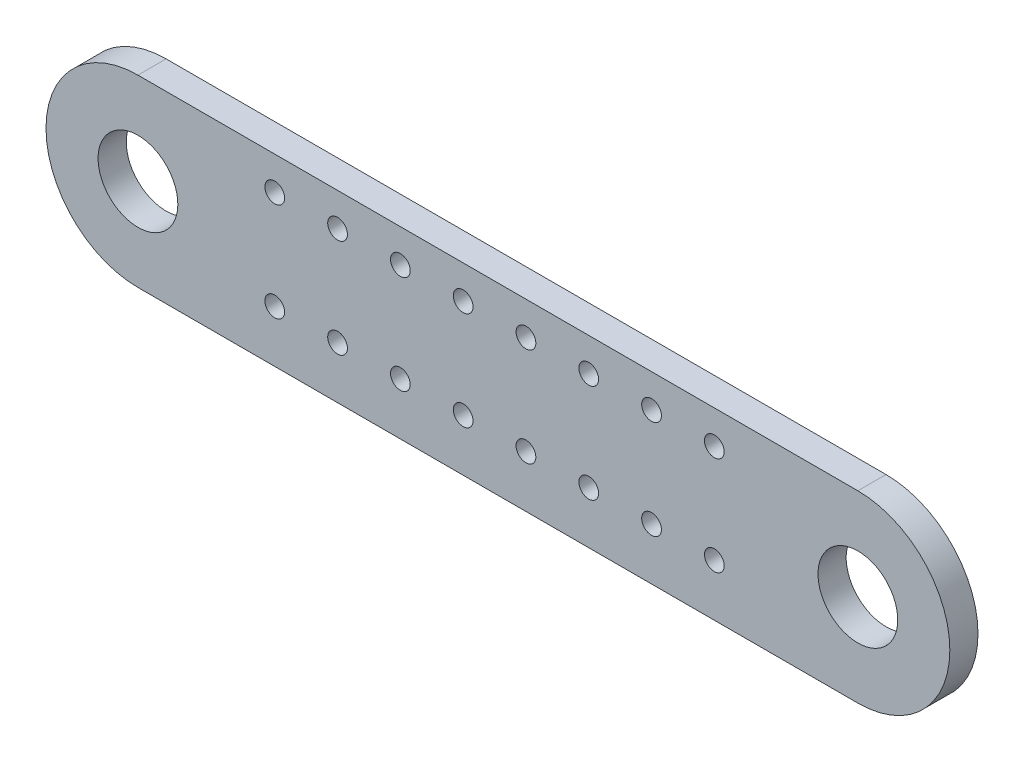
ISO-10303-21;
HEADER;
FILE_DESCRIPTION(('STEP AP214'),'2;1');
FILE_NAME('part.step','',(''),(''),'','','');
FILE_SCHEMA(('AUTOMOTIVE_DESIGN { 1 0 10303 214 1 1 1 1 }'));
ENDSEC;
DATA;
#1=APPLICATION_CONTEXT('core data for automotive mechanical design processes');
#2=APPLICATION_PROTOCOL_DEFINITION('international standard','automotive_design',2000,#1);
#3=PRODUCT_CONTEXT('',#1,'mechanical');
#4=PRODUCT('Part','Part','',(#3));
#5=PRODUCT_RELATED_PRODUCT_CATEGORY('part','',(#4));
#6=PRODUCT_DEFINITION_FORMATION('','',#4);
#7=PRODUCT_DEFINITION_CONTEXT('part definition',#1,'design');
#8=PRODUCT_DEFINITION('design','',#6,#7);
#9=PRODUCT_DEFINITION_SHAPE('','',#8);
#10=(LENGTH_UNIT() NAMED_UNIT(*) SI_UNIT(.MILLI.,.METRE.));
#11=(NAMED_UNIT(*) PLANE_ANGLE_UNIT() SI_UNIT($,.RADIAN.));
#12=(NAMED_UNIT(*) SI_UNIT($,.STERADIAN.) SOLID_ANGLE_UNIT());
#13=UNCERTAINTY_MEASURE_WITH_UNIT(LENGTH_MEASURE(1.E-05),#10,'distance_accuracy_value','');
#14=(GEOMETRIC_REPRESENTATION_CONTEXT(3) GLOBAL_UNCERTAINTY_ASSIGNED_CONTEXT((#13)) GLOBAL_UNIT_ASSIGNED_CONTEXT((#10,
#11,#12)) REPRESENTATION_CONTEXT('',''));
#15=CARTESIAN_POINT('',(0.,0.,0.));
#16=DIRECTION('',(0.,0.,1.));
#17=DIRECTION('',(1.,0.,0.));
#18=AXIS2_PLACEMENT_3D('',#15,#16,#17);
#19=CARTESIAN_POINT('',(25.1875,5.125,1.57));
#20=DIRECTION('',(0.,0.,1.));
#21=DIRECTION('',(1.,0.,0.));
#22=AXIS2_PLACEMENT_3D('',#19,#20,#21);
#23=PLANE('',#22);
#24=CARTESIAN_POINT('',(45.25,5.125,1.57));
#25=DIRECTION('',(0.,0.,1.));
#26=DIRECTION('',(1.,0.,0.));
#27=AXIS2_PLACEMENT_3D('',#24,#25,#26);
#28=CIRCLE('',#27,2.2225);
#29=CARTESIAN_POINT('',(47.4725,5.125,1.57));
#30=VERTEX_POINT('',#29);
#31=EDGE_CURVE('E137',#30,#30,#28,.F.);
#32=ORIENTED_EDGE('',*,*,#31,.T.);
#33=EDGE_LOOP('',(#32));
#34=FACE_BOUND('',#33,.T.);
#35=CARTESIAN_POINT('',(5.125,5.125,1.57));
#36=DIRECTION('',(0.,0.,1.));
#37=DIRECTION('',(1.,0.,0.));
#38=AXIS2_PLACEMENT_3D('',#35,#36,#37);
#39=CIRCLE('',#38,2.2225);
#40=CARTESIAN_POINT('',(7.3475,5.125,1.57));
#41=VERTEX_POINT('',#40);
#42=EDGE_CURVE('E140',#41,#41,#39,.F.);
#43=ORIENTED_EDGE('',*,*,#42,.T.);
#44=EDGE_LOOP('',(#43));
#45=FACE_BOUND('',#44,.T.);
#46=CARTESIAN_POINT('',(12.75,8.4,1.57));
#47=DIRECTION('',(0.,0.,1.));
#48=DIRECTION('',(1.,0.,0.));
#49=AXIS2_PLACEMENT_3D('',#46,#47,#48);
#50=CIRCLE('',#49,0.549999999999999);
#51=CARTESIAN_POINT('',(13.3,8.4,1.57));
#52=VERTEX_POINT('',#51);
#53=EDGE_CURVE('E143',#52,#52,#50,.F.);
#54=ORIENTED_EDGE('',*,*,#53,.T.);
#55=EDGE_LOOP('',(#54));
#56=FACE_BOUND('',#55,.T.);
#57=CARTESIAN_POINT('',(37.25,8.4,1.57));
#58=DIRECTION('',(0.,0.,1.));
#59=DIRECTION('',(1.,0.,0.));
#60=AXIS2_PLACEMENT_3D('',#57,#58,#59);
#61=CIRCLE('',#60,0.550000000000002);
#62=CARTESIAN_POINT('',(37.8,8.4,1.57));
#63=VERTEX_POINT('',#62);
#64=EDGE_CURVE('E146',#63,#63,#61,.F.);
#65=ORIENTED_EDGE('',*,*,#64,.T.);
#66=EDGE_LOOP('',(#65));
#67=FACE_BOUND('',#66,.T.);
#68=CARTESIAN_POINT('',(16.25,8.4,1.57));
#69=DIRECTION('',(0.,0.,1.));
#70=DIRECTION('',(1.,0.,0.));
#71=AXIS2_PLACEMENT_3D('',#68,#69,#70);
#72=CIRCLE('',#71,0.549999999999999);
#73=CARTESIAN_POINT('',(16.8,8.4,1.57));
#74=VERTEX_POINT('',#73);
#75=EDGE_CURVE('E149',#74,#74,#72,.F.);
#76=ORIENTED_EDGE('',*,*,#75,.T.);
#77=EDGE_LOOP('',(#76));
#78=FACE_BOUND('',#77,.T.);
#79=CARTESIAN_POINT('',(23.25,8.4,1.57));
#80=DIRECTION('',(0.,0.,1.));
#81=DIRECTION('',(1.,0.,0.));
#82=AXIS2_PLACEMENT_3D('',#79,#80,#81);
#83=CIRCLE('',#82,0.550000000000002);
#84=CARTESIAN_POINT('',(23.8,8.4,1.57));
#85=VERTEX_POINT('',#84);
#86=EDGE_CURVE('E152',#85,#85,#83,.F.);
#87=ORIENTED_EDGE('',*,*,#86,.T.);
#88=EDGE_LOOP('',(#87));
#89=FACE_BOUND('',#88,.T.);
#90=CARTESIAN_POINT('',(16.25,2.9,1.57));
#91=DIRECTION('',(0.,0.,1.));
#92=DIRECTION('',(1.,0.,0.));
#93=AXIS2_PLACEMENT_3D('',#90,#91,#92);
#94=CIRCLE('',#93,0.549999999999999);
#95=CARTESIAN_POINT('',(16.8,2.9,1.57));
#96=VERTEX_POINT('',#95);
#97=EDGE_CURVE('E155',#96,#96,#94,.F.);
#98=ORIENTED_EDGE('',*,*,#97,.T.);
#99=EDGE_LOOP('',(#98));
#100=FACE_BOUND('',#99,.T.);
#101=CARTESIAN_POINT('',(33.75,8.4,1.57));
#102=DIRECTION('',(0.,0.,1.));
#103=DIRECTION('',(1.,0.,0.));
#104=AXIS2_PLACEMENT_3D('',#101,#102,#103);
#105=CIRCLE('',#104,0.550000000000002);
#106=CARTESIAN_POINT('',(34.3,8.4,1.57));
#107=VERTEX_POINT('',#106);
#108=EDGE_CURVE('E158',#107,#107,#105,.F.);
#109=ORIENTED_EDGE('',*,*,#108,.T.);
#110=EDGE_LOOP('',(#109));
#111=FACE_BOUND('',#110,.T.);
#112=CARTESIAN_POINT('',(30.25,2.9,1.57));
#113=DIRECTION('',(0.,0.,1.));
#114=DIRECTION('',(1.,0.,0.));
#115=AXIS2_PLACEMENT_3D('',#112,#113,#114);
#116=CIRCLE('',#115,0.550000000000002);
#117=CARTESIAN_POINT('',(30.8,2.9,1.57));
#118=VERTEX_POINT('',#117);
#119=EDGE_CURVE('E161',#118,#118,#116,.F.);
#120=ORIENTED_EDGE('',*,*,#119,.T.);
#121=EDGE_LOOP('',(#120));
#122=FACE_BOUND('',#121,.T.);
#123=CARTESIAN_POINT('',(23.25,2.9,1.57));
#124=DIRECTION('',(0.,0.,1.));
#125=DIRECTION('',(1.,0.,0.));
#126=AXIS2_PLACEMENT_3D('',#123,#124,#125);
#127=CIRCLE('',#126,0.550000000000002);
#128=CARTESIAN_POINT('',(23.8,2.9,1.57));
#129=VERTEX_POINT('',#128);
#130=EDGE_CURVE('E164',#129,#129,#127,.F.);
#131=ORIENTED_EDGE('',*,*,#130,.T.);
#132=EDGE_LOOP('',(#131));
#133=FACE_BOUND('',#132,.T.);
#134=CARTESIAN_POINT('',(19.75,2.9,1.57));
#135=DIRECTION('',(0.,0.,1.));
#136=DIRECTION('',(1.,0.,0.));
#137=AXIS2_PLACEMENT_3D('',#134,#135,#136);
#138=CIRCLE('',#137,0.550000000000002);
#139=CARTESIAN_POINT('',(20.3,2.9,1.57));
#140=VERTEX_POINT('',#139);
#141=EDGE_CURVE('E167',#140,#140,#138,.F.);
#142=ORIENTED_EDGE('',*,*,#141,.T.);
#143=EDGE_LOOP('',(#142));
#144=FACE_BOUND('',#143,.T.);
#145=CARTESIAN_POINT('',(26.75,2.9,1.57));
#146=DIRECTION('',(0.,0.,1.));
#147=DIRECTION('',(1.,0.,0.));
#148=AXIS2_PLACEMENT_3D('',#145,#146,#147);
#149=CIRCLE('',#148,0.550000000000002);
#150=CARTESIAN_POINT('',(27.3,2.9,1.57));
#151=VERTEX_POINT('',#150);
#152=EDGE_CURVE('E170',#151,#151,#149,.F.);
#153=ORIENTED_EDGE('',*,*,#152,.T.);
#154=EDGE_LOOP('',(#153));
#155=FACE_BOUND('',#154,.T.);
#156=CARTESIAN_POINT('',(33.75,2.9,1.57));
#157=DIRECTION('',(0.,0.,1.));
#158=DIRECTION('',(1.,0.,0.));
#159=AXIS2_PLACEMENT_3D('',#156,#157,#158);
#160=CIRCLE('',#159,0.550000000000002);
#161=CARTESIAN_POINT('',(34.3,2.9,1.57));
#162=VERTEX_POINT('',#161);
#163=EDGE_CURVE('E173',#162,#162,#160,.F.);
#164=ORIENTED_EDGE('',*,*,#163,.T.);
#165=EDGE_LOOP('',(#164));
#166=FACE_BOUND('',#165,.T.);
#167=CARTESIAN_POINT('',(30.25,8.4,1.57));
#168=DIRECTION('',(0.,0.,1.));
#169=DIRECTION('',(1.,0.,0.));
#170=AXIS2_PLACEMENT_3D('',#167,#168,#169);
#171=CIRCLE('',#170,0.550000000000002);
#172=CARTESIAN_POINT('',(30.8,8.4,1.57));
#173=VERTEX_POINT('',#172);
#174=EDGE_CURVE('E176',#173,#173,#171,.F.);
#175=ORIENTED_EDGE('',*,*,#174,.T.);
#176=EDGE_LOOP('',(#175));
#177=FACE_BOUND('',#176,.T.);
#178=CARTESIAN_POINT('',(26.75,8.4,1.57));
#179=DIRECTION('',(0.,0.,1.));
#180=DIRECTION('',(1.,0.,0.));
#181=AXIS2_PLACEMENT_3D('',#178,#179,#180);
#182=CIRCLE('',#181,0.550000000000002);
#183=CARTESIAN_POINT('',(27.3,8.4,1.57));
#184=VERTEX_POINT('',#183);
#185=EDGE_CURVE('E179',#184,#184,#182,.F.);
#186=ORIENTED_EDGE('',*,*,#185,.T.);
#187=EDGE_LOOP('',(#186));
#188=FACE_BOUND('',#187,.T.);
#189=CARTESIAN_POINT('',(19.75,8.4,1.57));
#190=DIRECTION('',(0.,0.,1.));
#191=DIRECTION('',(1.,0.,0.));
#192=AXIS2_PLACEMENT_3D('',#189,#190,#191);
#193=CIRCLE('',#192,0.550000000000002);
#194=CARTESIAN_POINT('',(20.3,8.4,1.57));
#195=VERTEX_POINT('',#194);
#196=EDGE_CURVE('E182',#195,#195,#193,.F.);
#197=ORIENTED_EDGE('',*,*,#196,.T.);
#198=EDGE_LOOP('',(#197));
#199=FACE_BOUND('',#198,.T.);
#200=CARTESIAN_POINT('',(37.25,2.9,1.57));
#201=DIRECTION('',(0.,0.,1.));
#202=DIRECTION('',(1.,0.,0.));
#203=AXIS2_PLACEMENT_3D('',#200,#201,#202);
#204=CIRCLE('',#203,0.550000000000002);
#205=CARTESIAN_POINT('',(37.8,2.9,1.57));
#206=VERTEX_POINT('',#205);
#207=EDGE_CURVE('E185',#206,#206,#204,.F.);
#208=ORIENTED_EDGE('',*,*,#207,.T.);
#209=EDGE_LOOP('',(#208));
#210=FACE_BOUND('',#209,.T.);
#211=CARTESIAN_POINT('',(12.75,2.9,1.57));
#212=DIRECTION('',(0.,0.,1.));
#213=DIRECTION('',(1.,0.,0.));
#214=AXIS2_PLACEMENT_3D('',#211,#212,#213);
#215=CIRCLE('',#214,0.549999999999999);
#216=CARTESIAN_POINT('',(13.3,2.9,1.57));
#217=VERTEX_POINT('',#216);
#218=EDGE_CURVE('E188',#217,#217,#215,.F.);
#219=ORIENTED_EDGE('',*,*,#218,.T.);
#220=EDGE_LOOP('',(#219));
#221=FACE_BOUND('',#220,.T.);
#222=CARTESIAN_POINT('',(45.25,5.125,1.57));
#223=DIRECTION('',(0.,0.,1.));
#224=DIRECTION('',(1.,0.,0.));
#225=AXIS2_PLACEMENT_3D('',#222,#223,#224);
#226=CIRCLE('',#225,5.125);
#227=CARTESIAN_POINT('',(45.25,10.25,1.57));
#228=VERTEX_POINT('',#227);
#229=CARTESIAN_POINT('',(45.25,0.,1.57));
#230=VERTEX_POINT('',#229);
#231=EDGE_CURVE('E20',#228,#230,#226,.F.);
#232=ORIENTED_EDGE('',*,*,#231,.F.);
#233=DIRECTION('',(1.,0.,0.));
#234=VECTOR('',#233,1.);
#235=CARTESIAN_POINT('',(45.25,10.25,1.57));
#236=LINE('',#235,#234);
#237=CARTESIAN_POINT('',(5.125,10.25,1.57));
#238=VERTEX_POINT('',#237);
#239=EDGE_CURVE('E54',#238,#228,#236,.T.);
#240=ORIENTED_EDGE('',*,*,#239,.F.);
#241=CARTESIAN_POINT('',(5.125,5.125,1.57));
#242=DIRECTION('',(0.,0.,1.));
#243=DIRECTION('',(1.,0.,0.));
#244=AXIS2_PLACEMENT_3D('',#241,#242,#243);
#245=CIRCLE('',#244,5.125);
#246=CARTESIAN_POINT('',(5.125,0.,1.57));
#247=VERTEX_POINT('',#246);
#248=EDGE_CURVE('E69',#247,#238,#245,.F.);
#249=ORIENTED_EDGE('',*,*,#248,.F.);
#250=DIRECTION('',(1.,0.,0.));
#251=VECTOR('',#250,1.);
#252=CARTESIAN_POINT('',(5.125,0.,1.57));
#253=LINE('',#252,#251);
#254=EDGE_CURVE('E67',#230,#247,#253,.F.);
#255=ORIENTED_EDGE('',*,*,#254,.F.);
#256=EDGE_LOOP('',(#232,#240,#249,#255));
#257=FACE_BOUND('',#256,.T.);
#258=ADVANCED_FACE('F17',(#34,#45,#56,#67,#78,#89,#100,#111,#122,#133,#144,#155,#166,#177,#188,
#199,#210,#221,#257),#23,.T.);
#259=CARTESIAN_POINT('',(5.125,0.,0.));
#260=DIRECTION('',(0.,-1.,0.));
#261=DIRECTION('',(0.,0.,-1.));
#262=AXIS2_PLACEMENT_3D('',#259,#260,#261);
#263=PLANE('',#262);
#264=ORIENTED_EDGE('',*,*,#254,.T.);
#265=DIRECTION('',(0.,0.,1.));
#266=VECTOR('',#265,1.);
#267=CARTESIAN_POINT('',(5.125,0.,0.));
#268=LINE('',#267,#266);
#269=CARTESIAN_POINT('',(5.125,0.,0.));
#270=VERTEX_POINT('',#269);
#271=EDGE_CURVE('E190',#270,#247,#268,.T.);
#272=ORIENTED_EDGE('',*,*,#271,.F.);
#273=DIRECTION('',(1.,0.,0.));
#274=VECTOR('',#273,1.);
#275=CARTESIAN_POINT('',(25.1875,0.,0.));
#276=LINE('',#275,#274);
#277=CARTESIAN_POINT('',(45.25,0.,0.));
#278=VERTEX_POINT('',#277);
#279=EDGE_CURVE('E76',#270,#278,#276,.T.);
#280=ORIENTED_EDGE('',*,*,#279,.T.);
#281=DIRECTION('',(0.,0.,1.));
#282=VECTOR('',#281,1.);
#283=CARTESIAN_POINT('',(45.25,0.,0.));
#284=LINE('',#283,#282);
#285=EDGE_CURVE('E63',#230,#278,#284,.F.);
#286=ORIENTED_EDGE('',*,*,#285,.F.);
#287=EDGE_LOOP('',(#264,#272,#280,#286));
#288=FACE_BOUND('',#287,.T.);
#289=ADVANCED_FACE('F75',(#288),#263,.T.);
#290=CARTESIAN_POINT('',(45.25,5.125,0.));
#291=DIRECTION('',(0.,0.,1.));
#292=DIRECTION('',(1.,0.,0.));
#293=AXIS2_PLACEMENT_3D('',#290,#291,#292);
#294=CYLINDRICAL_SURFACE('',#293,5.125);
#295=ORIENTED_EDGE('',*,*,#231,.T.);
#296=ORIENTED_EDGE('',*,*,#285,.T.);
#297=CARTESIAN_POINT('',(45.25,5.125,0.));
#298=DIRECTION('',(0.,0.,1.));
#299=DIRECTION('',(1.,0.,0.));
#300=AXIS2_PLACEMENT_3D('',#297,#298,#299);
#301=CIRCLE('',#300,5.125);
#302=CARTESIAN_POINT('',(45.25,10.25,0.));
#303=VERTEX_POINT('',#302);
#304=EDGE_CURVE('E135',#278,#303,#301,.T.);
#305=ORIENTED_EDGE('',*,*,#304,.T.);
#306=DIRECTION('',(0.,0.,1.));
#307=VECTOR('',#306,1.);
#308=CARTESIAN_POINT('',(45.25,10.25,0.));
#309=LINE('',#308,#307);
#310=EDGE_CURVE('E65',#228,#303,#309,.F.);
#311=ORIENTED_EDGE('',*,*,#310,.F.);
#312=EDGE_LOOP('',(#295,#296,#305,#311));
#313=FACE_BOUND('',#312,.T.);
#314=ADVANCED_FACE('F60',(#313),#294,.T.);
#315=CARTESIAN_POINT('',(45.25,10.25,0.));
#316=DIRECTION('',(0.,1.,0.));
#317=DIRECTION('',(0.,0.,1.));
#318=AXIS2_PLACEMENT_3D('',#315,#316,#317);
#319=PLANE('',#318);
#320=ORIENTED_EDGE('',*,*,#239,.T.);
#321=ORIENTED_EDGE('',*,*,#310,.T.);
#322=DIRECTION('',(1.,0.,0.));
#323=VECTOR('',#322,1.);
#324=CARTESIAN_POINT('',(25.1875,10.25,0.));
#325=LINE('',#324,#323);
#326=CARTESIAN_POINT('',(5.125,10.25,0.));
#327=VERTEX_POINT('',#326);
#328=EDGE_CURVE('E134',#303,#327,#325,.F.);
#329=ORIENTED_EDGE('',*,*,#328,.T.);
#330=DIRECTION('',(0.,0.,1.));
#331=VECTOR('',#330,1.);
#332=CARTESIAN_POINT('',(5.125,10.25,0.));
#333=LINE('',#332,#331);
#334=EDGE_CURVE('E35',#238,#327,#333,.F.);
#335=ORIENTED_EDGE('',*,*,#334,.F.);
#336=EDGE_LOOP('',(#320,#321,#329,#335));
#337=FACE_BOUND('',#336,.T.);
#338=ADVANCED_FACE('F196',(#337),#319,.T.);
#339=CARTESIAN_POINT('',(5.125,5.125,0.));
#340=DIRECTION('',(0.,0.,1.));
#341=DIRECTION('',(1.,0.,0.));
#342=AXIS2_PLACEMENT_3D('',#339,#340,#341);
#343=CYLINDRICAL_SURFACE('',#342,5.125);
#344=ORIENTED_EDGE('',*,*,#248,.T.);
#345=ORIENTED_EDGE('',*,*,#334,.T.);
#346=CARTESIAN_POINT('',(5.125,5.125,0.));
#347=DIRECTION('',(0.,0.,1.));
#348=DIRECTION('',(1.,0.,0.));
#349=AXIS2_PLACEMENT_3D('',#346,#347,#348);
#350=CIRCLE('',#349,5.125);
#351=EDGE_CURVE('E132',#327,#270,#350,.T.);
#352=ORIENTED_EDGE('',*,*,#351,.T.);
#353=ORIENTED_EDGE('',*,*,#271,.T.);
#354=EDGE_LOOP('',(#344,#345,#352,#353));
#355=FACE_BOUND('',#354,.T.);
#356=ADVANCED_FACE('F199',(#355),#343,.T.);
#357=CARTESIAN_POINT('',(12.75,2.9,0.));
#358=DIRECTION('',(0.,0.,1.));
#359=DIRECTION('',(1.,0.,0.));
#360=AXIS2_PLACEMENT_3D('',#357,#358,#359);
#361=CYLINDRICAL_SURFACE('',#360,0.549999999999999);
#362=ORIENTED_EDGE('',*,*,#218,.F.);
#363=EDGE_LOOP('',(#362));
#364=FACE_BOUND('',#363,.T.);
#365=CARTESIAN_POINT('',(12.75,2.9,0.));
#366=DIRECTION('',(0.,0.,1.));
#367=DIRECTION('',(1.,0.,0.));
#368=AXIS2_PLACEMENT_3D('',#365,#366,#367);
#369=CIRCLE('',#368,0.549999999999999);
#370=CARTESIAN_POINT('',(13.3,2.9,0.));
#371=VERTEX_POINT('',#370);
#372=EDGE_CURVE('E129',#371,#371,#369,.F.);
#373=ORIENTED_EDGE('',*,*,#372,.T.);
#374=EDGE_LOOP('',(#373));
#375=FACE_BOUND('',#374,.T.);
#376=ADVANCED_FACE('F201',(#364,#375),#361,.F.);
#377=CARTESIAN_POINT('',(37.25,2.9,0.));
#378=DIRECTION('',(0.,0.,1.));
#379=DIRECTION('',(1.,0.,0.));
#380=AXIS2_PLACEMENT_3D('',#377,#378,#379);
#381=CYLINDRICAL_SURFACE('',#380,0.550000000000002);
#382=ORIENTED_EDGE('',*,*,#207,.F.);
#383=EDGE_LOOP('',(#382));
#384=FACE_BOUND('',#383,.T.);
#385=CARTESIAN_POINT('',(37.25,2.9,0.));
#386=DIRECTION('',(0.,0.,1.));
#387=DIRECTION('',(1.,0.,0.));
#388=AXIS2_PLACEMENT_3D('',#385,#386,#387);
#389=CIRCLE('',#388,0.550000000000002);
#390=CARTESIAN_POINT('',(37.8,2.9,0.));
#391=VERTEX_POINT('',#390);
#392=EDGE_CURVE('E126',#391,#391,#389,.F.);
#393=ORIENTED_EDGE('',*,*,#392,.T.);
#394=EDGE_LOOP('',(#393));
#395=FACE_BOUND('',#394,.T.);
#396=ADVANCED_FACE('F208',(#384,#395),#381,.F.);
#397=CARTESIAN_POINT('',(19.75,8.4,0.));
#398=DIRECTION('',(0.,0.,1.));
#399=DIRECTION('',(1.,0.,0.));
#400=AXIS2_PLACEMENT_3D('',#397,#398,#399);
#401=CYLINDRICAL_SURFACE('',#400,0.550000000000002);
#402=ORIENTED_EDGE('',*,*,#196,.F.);
#403=EDGE_LOOP('',(#402));
#404=FACE_BOUND('',#403,.T.);
#405=CARTESIAN_POINT('',(19.75,8.4,0.));
#406=DIRECTION('',(0.,0.,1.));
#407=DIRECTION('',(1.,0.,0.));
#408=AXIS2_PLACEMENT_3D('',#405,#406,#407);
#409=CIRCLE('',#408,0.550000000000002);
#410=CARTESIAN_POINT('',(20.3,8.4,0.));
#411=VERTEX_POINT('',#410);
#412=EDGE_CURVE('E123',#411,#411,#409,.F.);
#413=ORIENTED_EDGE('',*,*,#412,.T.);
#414=EDGE_LOOP('',(#413));
#415=FACE_BOUND('',#414,.T.);
#416=ADVANCED_FACE('F279',(#404,#415),#401,.F.);
#417=CARTESIAN_POINT('',(26.75,8.4,0.));
#418=DIRECTION('',(0.,0.,1.));
#419=DIRECTION('',(1.,0.,0.));
#420=AXIS2_PLACEMENT_3D('',#417,#418,#419);
#421=CYLINDRICAL_SURFACE('',#420,0.550000000000002);
#422=ORIENTED_EDGE('',*,*,#185,.F.);
#423=EDGE_LOOP('',(#422));
#424=FACE_BOUND('',#423,.T.);
#425=CARTESIAN_POINT('',(26.75,8.4,0.));
#426=DIRECTION('',(0.,0.,1.));
#427=DIRECTION('',(1.,0.,0.));
#428=AXIS2_PLACEMENT_3D('',#425,#426,#427);
#429=CIRCLE('',#428,0.550000000000002);
#430=CARTESIAN_POINT('',(27.3,8.4,0.));
#431=VERTEX_POINT('',#430);
#432=EDGE_CURVE('E120',#431,#431,#429,.F.);
#433=ORIENTED_EDGE('',*,*,#432,.T.);
#434=EDGE_LOOP('',(#433));
#435=FACE_BOUND('',#434,.T.);
#436=ADVANCED_FACE('F275',(#424,#435),#421,.F.);
#437=CARTESIAN_POINT('',(30.25,8.4,0.));
#438=DIRECTION('',(0.,0.,1.));
#439=DIRECTION('',(1.,0.,0.));
#440=AXIS2_PLACEMENT_3D('',#437,#438,#439);
#441=CYLINDRICAL_SURFACE('',#440,0.550000000000002);
#442=ORIENTED_EDGE('',*,*,#174,.F.);
#443=EDGE_LOOP('',(#442));
#444=FACE_BOUND('',#443,.T.);
#445=CARTESIAN_POINT('',(30.25,8.4,0.));
#446=DIRECTION('',(0.,0.,1.));
#447=DIRECTION('',(1.,0.,0.));
#448=AXIS2_PLACEMENT_3D('',#445,#446,#447);
#449=CIRCLE('',#448,0.550000000000002);
#450=CARTESIAN_POINT('',(30.8,8.4,0.));
#451=VERTEX_POINT('',#450);
#452=EDGE_CURVE('E117',#451,#451,#449,.F.);
#453=ORIENTED_EDGE('',*,*,#452,.T.);
#454=EDGE_LOOP('',(#453));
#455=FACE_BOUND('',#454,.T.);
#456=ADVANCED_FACE('F271',(#444,#455),#441,.F.);
#457=CARTESIAN_POINT('',(33.75,2.9,0.));
#458=DIRECTION('',(0.,0.,1.));
#459=DIRECTION('',(1.,0.,0.));
#460=AXIS2_PLACEMENT_3D('',#457,#458,#459);
#461=CYLINDRICAL_SURFACE('',#460,0.550000000000002);
#462=ORIENTED_EDGE('',*,*,#163,.F.);
#463=EDGE_LOOP('',(#462));
#464=FACE_BOUND('',#463,.T.);
#465=CARTESIAN_POINT('',(33.75,2.9,0.));
#466=DIRECTION('',(0.,0.,1.));
#467=DIRECTION('',(1.,0.,0.));
#468=AXIS2_PLACEMENT_3D('',#465,#466,#467);
#469=CIRCLE('',#468,0.550000000000002);
#470=CARTESIAN_POINT('',(34.3,2.9,0.));
#471=VERTEX_POINT('',#470);
#472=EDGE_CURVE('E114',#471,#471,#469,.F.);
#473=ORIENTED_EDGE('',*,*,#472,.T.);
#474=EDGE_LOOP('',(#473));
#475=FACE_BOUND('',#474,.T.);
#476=ADVANCED_FACE('F267',(#464,#475),#461,.F.);
#477=CARTESIAN_POINT('',(26.75,2.9,0.));
#478=DIRECTION('',(0.,0.,1.));
#479=DIRECTION('',(1.,0.,0.));
#480=AXIS2_PLACEMENT_3D('',#477,#478,#479);
#481=CYLINDRICAL_SURFACE('',#480,0.550000000000002);
#482=ORIENTED_EDGE('',*,*,#152,.F.);
#483=EDGE_LOOP('',(#482));
#484=FACE_BOUND('',#483,.T.);
#485=CARTESIAN_POINT('',(26.75,2.9,0.));
#486=DIRECTION('',(0.,0.,1.));
#487=DIRECTION('',(1.,0.,0.));
#488=AXIS2_PLACEMENT_3D('',#485,#486,#487);
#489=CIRCLE('',#488,0.550000000000002);
#490=CARTESIAN_POINT('',(27.3,2.9,0.));
#491=VERTEX_POINT('',#490);
#492=EDGE_CURVE('E111',#491,#491,#489,.F.);
#493=ORIENTED_EDGE('',*,*,#492,.T.);
#494=EDGE_LOOP('',(#493));
#495=FACE_BOUND('',#494,.T.);
#496=ADVANCED_FACE('F263',(#484,#495),#481,.F.);
#497=CARTESIAN_POINT('',(19.75,2.9,0.));
#498=DIRECTION('',(0.,0.,1.));
#499=DIRECTION('',(1.,0.,0.));
#500=AXIS2_PLACEMENT_3D('',#497,#498,#499);
#501=CYLINDRICAL_SURFACE('',#500,0.550000000000002);
#502=ORIENTED_EDGE('',*,*,#141,.F.);
#503=EDGE_LOOP('',(#502));
#504=FACE_BOUND('',#503,.T.);
#505=CARTESIAN_POINT('',(19.75,2.9,0.));
#506=DIRECTION('',(0.,0.,1.));
#507=DIRECTION('',(1.,0.,0.));
#508=AXIS2_PLACEMENT_3D('',#505,#506,#507);
#509=CIRCLE('',#508,0.550000000000002);
#510=CARTESIAN_POINT('',(20.3,2.9,0.));
#511=VERTEX_POINT('',#510);
#512=EDGE_CURVE('E108',#511,#511,#509,.F.);
#513=ORIENTED_EDGE('',*,*,#512,.T.);
#514=EDGE_LOOP('',(#513));
#515=FACE_BOUND('',#514,.T.);
#516=ADVANCED_FACE('F259',(#504,#515),#501,.F.);
#517=CARTESIAN_POINT('',(23.25,2.9,0.));
#518=DIRECTION('',(0.,0.,1.));
#519=DIRECTION('',(1.,0.,0.));
#520=AXIS2_PLACEMENT_3D('',#517,#518,#519);
#521=CYLINDRICAL_SURFACE('',#520,0.550000000000002);
#522=ORIENTED_EDGE('',*,*,#130,.F.);
#523=EDGE_LOOP('',(#522));
#524=FACE_BOUND('',#523,.T.);
#525=CARTESIAN_POINT('',(23.25,2.9,0.));
#526=DIRECTION('',(0.,0.,1.));
#527=DIRECTION('',(1.,0.,0.));
#528=AXIS2_PLACEMENT_3D('',#525,#526,#527);
#529=CIRCLE('',#528,0.550000000000002);
#530=CARTESIAN_POINT('',(23.8,2.9,0.));
#531=VERTEX_POINT('',#530);
#532=EDGE_CURVE('E105',#531,#531,#529,.F.);
#533=ORIENTED_EDGE('',*,*,#532,.T.);
#534=EDGE_LOOP('',(#533));
#535=FACE_BOUND('',#534,.T.);
#536=ADVANCED_FACE('F255',(#524,#535),#521,.F.);
#537=CARTESIAN_POINT('',(30.25,2.9,0.));
#538=DIRECTION('',(0.,0.,1.));
#539=DIRECTION('',(1.,0.,0.));
#540=AXIS2_PLACEMENT_3D('',#537,#538,#539);
#541=CYLINDRICAL_SURFACE('',#540,0.550000000000002);
#542=ORIENTED_EDGE('',*,*,#119,.F.);
#543=EDGE_LOOP('',(#542));
#544=FACE_BOUND('',#543,.T.);
#545=CARTESIAN_POINT('',(30.25,2.9,0.));
#546=DIRECTION('',(0.,0.,1.));
#547=DIRECTION('',(1.,0.,0.));
#548=AXIS2_PLACEMENT_3D('',#545,#546,#547);
#549=CIRCLE('',#548,0.550000000000002);
#550=CARTESIAN_POINT('',(30.8,2.9,0.));
#551=VERTEX_POINT('',#550);
#552=EDGE_CURVE('E102',#551,#551,#549,.F.);
#553=ORIENTED_EDGE('',*,*,#552,.T.);
#554=EDGE_LOOP('',(#553));
#555=FACE_BOUND('',#554,.T.);
#556=ADVANCED_FACE('F251',(#544,#555),#541,.F.);
#557=CARTESIAN_POINT('',(33.75,8.4,0.));
#558=DIRECTION('',(0.,0.,1.));
#559=DIRECTION('',(1.,0.,0.));
#560=AXIS2_PLACEMENT_3D('',#557,#558,#559);
#561=CYLINDRICAL_SURFACE('',#560,0.550000000000002);
#562=ORIENTED_EDGE('',*,*,#108,.F.);
#563=EDGE_LOOP('',(#562));
#564=FACE_BOUND('',#563,.T.);
#565=CARTESIAN_POINT('',(33.75,8.4,0.));
#566=DIRECTION('',(0.,0.,1.));
#567=DIRECTION('',(1.,0.,0.));
#568=AXIS2_PLACEMENT_3D('',#565,#566,#567);
#569=CIRCLE('',#568,0.550000000000002);
#570=CARTESIAN_POINT('',(34.3,8.4,0.));
#571=VERTEX_POINT('',#570);
#572=EDGE_CURVE('E99',#571,#571,#569,.F.);
#573=ORIENTED_EDGE('',*,*,#572,.T.);
#574=EDGE_LOOP('',(#573));
#575=FACE_BOUND('',#574,.T.);
#576=ADVANCED_FACE('F247',(#564,#575),#561,.F.);
#577=CARTESIAN_POINT('',(16.25,2.9,0.));
#578=DIRECTION('',(0.,0.,1.));
#579=DIRECTION('',(1.,0.,0.));
#580=AXIS2_PLACEMENT_3D('',#577,#578,#579);
#581=CYLINDRICAL_SURFACE('',#580,0.549999999999999);
#582=ORIENTED_EDGE('',*,*,#97,.F.);
#583=EDGE_LOOP('',(#582));
#584=FACE_BOUND('',#583,.T.);
#585=CARTESIAN_POINT('',(16.25,2.9,0.));
#586=DIRECTION('',(0.,0.,1.));
#587=DIRECTION('',(1.,0.,0.));
#588=AXIS2_PLACEMENT_3D('',#585,#586,#587);
#589=CIRCLE('',#588,0.549999999999999);
#590=CARTESIAN_POINT('',(16.8,2.9,0.));
#591=VERTEX_POINT('',#590);
#592=EDGE_CURVE('E96',#591,#591,#589,.F.);
#593=ORIENTED_EDGE('',*,*,#592,.T.);
#594=EDGE_LOOP('',(#593));
#595=FACE_BOUND('',#594,.T.);
#596=ADVANCED_FACE('F243',(#584,#595),#581,.F.);
#597=CARTESIAN_POINT('',(23.25,8.4,0.));
#598=DIRECTION('',(0.,0.,1.));
#599=DIRECTION('',(1.,0.,0.));
#600=AXIS2_PLACEMENT_3D('',#597,#598,#599);
#601=CYLINDRICAL_SURFACE('',#600,0.550000000000002);
#602=ORIENTED_EDGE('',*,*,#86,.F.);
#603=EDGE_LOOP('',(#602));
#604=FACE_BOUND('',#603,.T.);
#605=CARTESIAN_POINT('',(23.25,8.4,0.));
#606=DIRECTION('',(0.,0.,1.));
#607=DIRECTION('',(1.,0.,0.));
#608=AXIS2_PLACEMENT_3D('',#605,#606,#607);
#609=CIRCLE('',#608,0.550000000000002);
#610=CARTESIAN_POINT('',(23.8,8.4,0.));
#611=VERTEX_POINT('',#610);
#612=EDGE_CURVE('E93',#611,#611,#609,.F.);
#613=ORIENTED_EDGE('',*,*,#612,.T.);
#614=EDGE_LOOP('',(#613));
#615=FACE_BOUND('',#614,.T.);
#616=ADVANCED_FACE('F239',(#604,#615),#601,.F.);
#617=CARTESIAN_POINT('',(16.25,8.4,0.));
#618=DIRECTION('',(0.,0.,1.));
#619=DIRECTION('',(1.,0.,0.));
#620=AXIS2_PLACEMENT_3D('',#617,#618,#619);
#621=CYLINDRICAL_SURFACE('',#620,0.549999999999999);
#622=ORIENTED_EDGE('',*,*,#75,.F.);
#623=EDGE_LOOP('',(#622));
#624=FACE_BOUND('',#623,.T.);
#625=CARTESIAN_POINT('',(16.25,8.4,0.));
#626=DIRECTION('',(0.,0.,1.));
#627=DIRECTION('',(1.,0.,0.));
#628=AXIS2_PLACEMENT_3D('',#625,#626,#627);
#629=CIRCLE('',#628,0.549999999999999);
#630=CARTESIAN_POINT('',(16.8,8.4,0.));
#631=VERTEX_POINT('',#630);
#632=EDGE_CURVE('E90',#631,#631,#629,.F.);
#633=ORIENTED_EDGE('',*,*,#632,.T.);
#634=EDGE_LOOP('',(#633));
#635=FACE_BOUND('',#634,.T.);
#636=ADVANCED_FACE('F235',(#624,#635),#621,.F.);
#637=CARTESIAN_POINT('',(37.25,8.4,0.));
#638=DIRECTION('',(0.,0.,1.));
#639=DIRECTION('',(1.,0.,0.));
#640=AXIS2_PLACEMENT_3D('',#637,#638,#639);
#641=CYLINDRICAL_SURFACE('',#640,0.550000000000002);
#642=ORIENTED_EDGE('',*,*,#64,.F.);
#643=EDGE_LOOP('',(#642));
#644=FACE_BOUND('',#643,.T.);
#645=CARTESIAN_POINT('',(37.25,8.4,0.));
#646=DIRECTION('',(0.,0.,1.));
#647=DIRECTION('',(1.,0.,0.));
#648=AXIS2_PLACEMENT_3D('',#645,#646,#647);
#649=CIRCLE('',#648,0.550000000000002);
#650=CARTESIAN_POINT('',(37.8,8.4,0.));
#651=VERTEX_POINT('',#650);
#652=EDGE_CURVE('E87',#651,#651,#649,.F.);
#653=ORIENTED_EDGE('',*,*,#652,.T.);
#654=EDGE_LOOP('',(#653));
#655=FACE_BOUND('',#654,.T.);
#656=ADVANCED_FACE('F231',(#644,#655),#641,.F.);
#657=CARTESIAN_POINT('',(12.75,8.4,0.));
#658=DIRECTION('',(0.,0.,1.));
#659=DIRECTION('',(1.,0.,0.));
#660=AXIS2_PLACEMENT_3D('',#657,#658,#659);
#661=CYLINDRICAL_SURFACE('',#660,0.549999999999999);
#662=ORIENTED_EDGE('',*,*,#53,.F.);
#663=EDGE_LOOP('',(#662));
#664=FACE_BOUND('',#663,.T.);
#665=CARTESIAN_POINT('',(12.75,8.4,0.));
#666=DIRECTION('',(0.,0.,1.));
#667=DIRECTION('',(1.,0.,0.));
#668=AXIS2_PLACEMENT_3D('',#665,#666,#667);
#669=CIRCLE('',#668,0.549999999999999);
#670=CARTESIAN_POINT('',(13.3,8.4,0.));
#671=VERTEX_POINT('',#670);
#672=EDGE_CURVE('E84',#671,#671,#669,.F.);
#673=ORIENTED_EDGE('',*,*,#672,.T.);
#674=EDGE_LOOP('',(#673));
#675=FACE_BOUND('',#674,.T.);
#676=ADVANCED_FACE('F227',(#664,#675),#661,.F.);
#677=CARTESIAN_POINT('',(5.125,5.125,0.));
#678=DIRECTION('',(0.,0.,1.));
#679=DIRECTION('',(1.,0.,0.));
#680=AXIS2_PLACEMENT_3D('',#677,#678,#679);
#681=CYLINDRICAL_SURFACE('',#680,2.2225);
#682=CARTESIAN_POINT('',(5.125,5.125,0.));
#683=DIRECTION('',(0.,0.,1.));
#684=DIRECTION('',(1.,0.,0.));
#685=AXIS2_PLACEMENT_3D('',#682,#683,#684);
#686=CIRCLE('',#685,2.2225);
#687=CARTESIAN_POINT('',(7.3475,5.125,0.));
#688=VERTEX_POINT('',#687);
#689=EDGE_CURVE('E26',#688,#688,#686,.F.);
#690=ORIENTED_EDGE('',*,*,#689,.T.);
#691=EDGE_LOOP('',(#690));
#692=FACE_BOUND('',#691,.T.);
#693=ORIENTED_EDGE('',*,*,#42,.F.);
#694=EDGE_LOOP('',(#693));
#695=FACE_BOUND('',#694,.T.);
#696=ADVANCED_FACE('F219',(#692,#695),#681,.F.);
#697=CARTESIAN_POINT('',(45.25,5.125,0.));
#698=DIRECTION('',(0.,0.,1.));
#699=DIRECTION('',(1.,0.,0.));
#700=AXIS2_PLACEMENT_3D('',#697,#698,#699);
#701=CYLINDRICAL_SURFACE('',#700,2.2225);
#702=CARTESIAN_POINT('',(45.25,5.125,0.));
#703=DIRECTION('',(0.,0.,1.));
#704=DIRECTION('',(1.,0.,0.));
#705=AXIS2_PLACEMENT_3D('',#702,#703,#704);
#706=CIRCLE('',#705,2.2225);
#707=CARTESIAN_POINT('',(47.4725,5.125,0.));
#708=VERTEX_POINT('',#707);
#709=EDGE_CURVE('E11',#708,#708,#706,.F.);
#710=ORIENTED_EDGE('',*,*,#709,.T.);
#711=EDGE_LOOP('',(#710));
#712=FACE_BOUND('',#711,.T.);
#713=ORIENTED_EDGE('',*,*,#31,.F.);
#714=EDGE_LOOP('',(#713));
#715=FACE_BOUND('',#714,.T.);
#716=ADVANCED_FACE('F213',(#712,#715),#701,.F.);
#717=CARTESIAN_POINT('',(25.1875,5.125,0.));
#718=DIRECTION('',(0.,0.,1.));
#719=DIRECTION('',(1.,0.,0.));
#720=AXIS2_PLACEMENT_3D('',#717,#718,#719);
#721=PLANE('',#720);
#722=ORIENTED_EDGE('',*,*,#709,.F.);
#723=EDGE_LOOP('',(#722));
#724=FACE_BOUND('',#723,.T.);
#725=ORIENTED_EDGE('',*,*,#689,.F.);
#726=EDGE_LOOP('',(#725));
#727=FACE_BOUND('',#726,.T.);
#728=ORIENTED_EDGE('',*,*,#672,.F.);
#729=EDGE_LOOP('',(#728));
#730=FACE_BOUND('',#729,.T.);
#731=ORIENTED_EDGE('',*,*,#652,.F.);
#732=EDGE_LOOP('',(#731));
#733=FACE_BOUND('',#732,.T.);
#734=ORIENTED_EDGE('',*,*,#632,.F.);
#735=EDGE_LOOP('',(#734));
#736=FACE_BOUND('',#735,.T.);
#737=ORIENTED_EDGE('',*,*,#612,.F.);
#738=EDGE_LOOP('',(#737));
#739=FACE_BOUND('',#738,.T.);
#740=ORIENTED_EDGE('',*,*,#592,.F.);
#741=EDGE_LOOP('',(#740));
#742=FACE_BOUND('',#741,.T.);
#743=ORIENTED_EDGE('',*,*,#572,.F.);
#744=EDGE_LOOP('',(#743));
#745=FACE_BOUND('',#744,.T.);
#746=ORIENTED_EDGE('',*,*,#552,.F.);
#747=EDGE_LOOP('',(#746));
#748=FACE_BOUND('',#747,.T.);
#749=ORIENTED_EDGE('',*,*,#532,.F.);
#750=EDGE_LOOP('',(#749));
#751=FACE_BOUND('',#750,.T.);
#752=ORIENTED_EDGE('',*,*,#512,.F.);
#753=EDGE_LOOP('',(#752));
#754=FACE_BOUND('',#753,.T.);
#755=ORIENTED_EDGE('',*,*,#492,.F.);
#756=EDGE_LOOP('',(#755));
#757=FACE_BOUND('',#756,.T.);
#758=ORIENTED_EDGE('',*,*,#472,.F.);
#759=EDGE_LOOP('',(#758));
#760=FACE_BOUND('',#759,.T.);
#761=ORIENTED_EDGE('',*,*,#452,.F.);
#762=EDGE_LOOP('',(#761));
#763=FACE_BOUND('',#762,.T.);
#764=ORIENTED_EDGE('',*,*,#432,.F.);
#765=EDGE_LOOP('',(#764));
#766=FACE_BOUND('',#765,.T.);
#767=ORIENTED_EDGE('',*,*,#412,.F.);
#768=EDGE_LOOP('',(#767));
#769=FACE_BOUND('',#768,.T.);
#770=ORIENTED_EDGE('',*,*,#392,.F.);
#771=EDGE_LOOP('',(#770));
#772=FACE_BOUND('',#771,.T.);
#773=ORIENTED_EDGE('',*,*,#372,.F.);
#774=EDGE_LOOP('',(#773));
#775=FACE_BOUND('',#774,.T.);
#776=ORIENTED_EDGE('',*,*,#328,.F.);
#777=ORIENTED_EDGE('',*,*,#304,.F.);
#778=ORIENTED_EDGE('',*,*,#279,.F.);
#779=ORIENTED_EDGE('',*,*,#351,.F.);
#780=EDGE_LOOP('',(#776,#777,#778,#779));
#781=FACE_BOUND('',#780,.T.);
#782=ADVANCED_FACE('F198',(#724,#727,#730,#733,#736,#739,#742,#745,#748,#751,#754,#757,#760,
#763,#766,#769,#772,#775,#781),#721,.F.);
#783=CLOSED_SHELL('',(#258,#289,#314,#338,#356,#376,#396,#416,#436,#456,#476,#496,#516,#536,
#556,#576,#596,#616,#636,#656,#676,#696,#716,#782));
#784=MANIFOLD_SOLID_BREP('B1',#783);
#785=ADVANCED_BREP_SHAPE_REPRESENTATION('',(#18,#784),#14);
#786=SHAPE_DEFINITION_REPRESENTATION(#9,#785);
ENDSEC;
END-ISO-10303-21;
